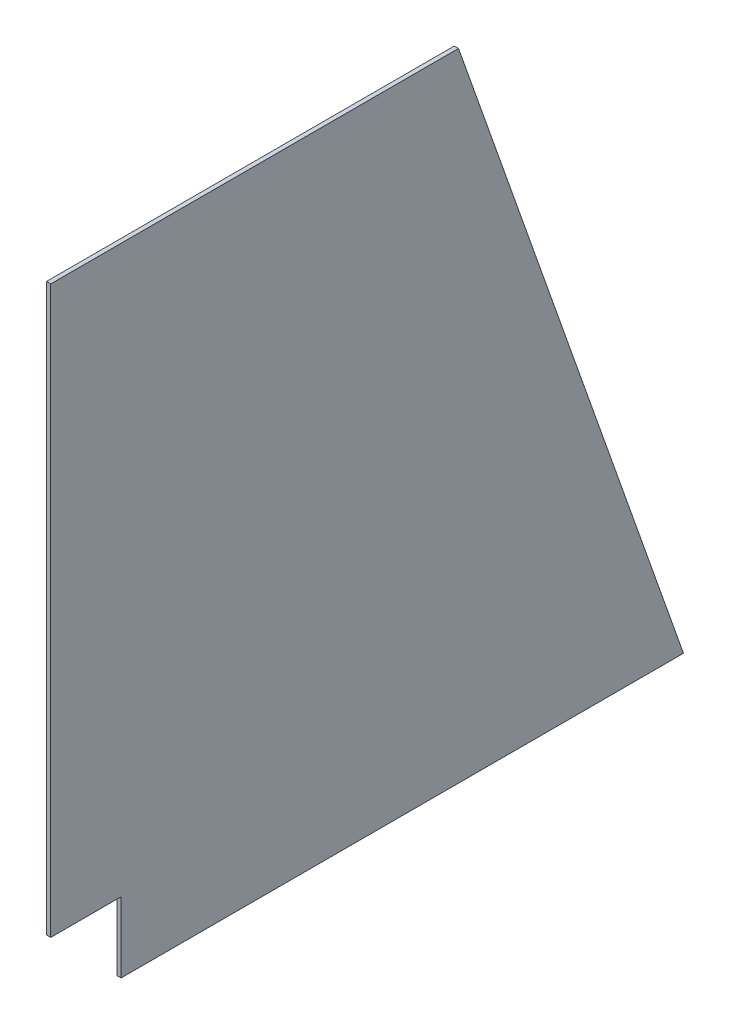
ISO-10303-21;
HEADER;
FILE_DESCRIPTION(('STEP AP214'),'2;1');
FILE_NAME('part.step','',(''),(''),'','','');
FILE_SCHEMA(('AUTOMOTIVE_DESIGN { 1 0 10303 214 1 1 1 1 }'));
ENDSEC;
DATA;
#1=APPLICATION_CONTEXT('core data for automotive mechanical design processes');
#2=APPLICATION_PROTOCOL_DEFINITION('international standard','automotive_design',2000,#1);
#3=PRODUCT_CONTEXT('',#1,'mechanical');
#4=PRODUCT('Part','Part','',(#3));
#5=PRODUCT_RELATED_PRODUCT_CATEGORY('part','',(#4));
#6=PRODUCT_DEFINITION_FORMATION('','',#4);
#7=PRODUCT_DEFINITION_CONTEXT('part definition',#1,'design');
#8=PRODUCT_DEFINITION('design','',#6,#7);
#9=PRODUCT_DEFINITION_SHAPE('','',#8);
#10=(LENGTH_UNIT() NAMED_UNIT(*) SI_UNIT(.MILLI.,.METRE.));
#11=(NAMED_UNIT(*) PLANE_ANGLE_UNIT() SI_UNIT($,.RADIAN.));
#12=(NAMED_UNIT(*) SI_UNIT($,.STERADIAN.) SOLID_ANGLE_UNIT());
#13=UNCERTAINTY_MEASURE_WITH_UNIT(LENGTH_MEASURE(1.E-05),#10,'distance_accuracy_value','');
#14=(GEOMETRIC_REPRESENTATION_CONTEXT(3) GLOBAL_UNCERTAINTY_ASSIGNED_CONTEXT((#13)) GLOBAL_UNIT_ASSIGNED_CONTEXT((#10,
#11,#12)) REPRESENTATION_CONTEXT('',''));
#15=CARTESIAN_POINT('',(0.,0.,0.));
#16=DIRECTION('',(0.,0.,1.));
#17=DIRECTION('',(1.,0.,0.));
#18=AXIS2_PLACEMENT_3D('',#15,#16,#17);
#19=CARTESIAN_POINT('',(3.,625.573683548744,258.33033120368));
#20=DIRECTION('',(0.,-1.,0.));
#21=DIRECTION('',(0.,0.,-1.));
#22=AXIS2_PLACEMENT_3D('',#19,#20,#21);
#23=PLANE('',#22);
#24=DIRECTION('',(0.,0.,1.));
#25=VECTOR('',#24,1.);
#26=CARTESIAN_POINT('',(0.,625.573683548744,258.33033120368));
#27=LINE('',#26,#25);
#28=CARTESIAN_POINT('',(0.,625.573683548744,-31.66966879632));
#29=VERTEX_POINT('',#28);
#30=CARTESIAN_POINT('',(0.,625.573683548744,258.33033120368));
#31=VERTEX_POINT('',#30);
#32=EDGE_CURVE('E132',#29,#31,#27,.T.);
#33=ORIENTED_EDGE('',*,*,#32,.T.);
#34=DIRECTION('',(-1.,0.,0.));
#35=VECTOR('',#34,1.);
#36=CARTESIAN_POINT('',(3.,625.573683548744,258.33033120368));
#37=LINE('',#36,#35);
#38=CARTESIAN_POINT('',(3.,625.573683548744,258.33033120368));
#39=VERTEX_POINT('',#38);
#40=EDGE_CURVE('E11',#39,#31,#37,.T.);
#41=ORIENTED_EDGE('',*,*,#40,.F.);
#42=DIRECTION('',(0.,0.,1.));
#43=VECTOR('',#42,1.);
#44=CARTESIAN_POINT('',(3.,625.573683548744,258.33033120368));
#45=LINE('',#44,#43);
#46=CARTESIAN_POINT('',(3.,625.573683548744,-31.66966879632));
#47=VERTEX_POINT('',#46);
#48=EDGE_CURVE('E133',#47,#39,#45,.T.);
#49=ORIENTED_EDGE('',*,*,#48,.F.);
#50=DIRECTION('',(-1.,0.,0.));
#51=VECTOR('',#50,1.);
#52=CARTESIAN_POINT('',(3.,625.573683548744,-31.66966879632));
#53=LINE('',#52,#51);
#54=EDGE_CURVE('E143',#47,#29,#53,.T.);
#55=ORIENTED_EDGE('',*,*,#54,.T.);
#56=EDGE_LOOP('',(#33,#41,#49,#55));
#57=FACE_BOUND('',#56,.T.);
#58=ADVANCED_FACE('F38',(#57),#23,.F.);
#59=CARTESIAN_POINT('',(3.,625.573683548744,258.33033120368));
#60=DIRECTION('',(0.,0.,-1.));
#61=DIRECTION('',(-1.,0.,0.));
#62=AXIS2_PLACEMENT_3D('',#59,#60,#61);
#63=PLANE('',#62);
#64=DIRECTION('',(0.,-1.,0.));
#65=VECTOR('',#64,1.);
#66=CARTESIAN_POINT('',(0.,625.573683548744,258.33033120368));
#67=LINE('',#66,#65);
#68=CARTESIAN_POINT('',(0.,223.025343589353,258.33033120368));
#69=VERTEX_POINT('',#68);
#70=EDGE_CURVE('E147',#31,#69,#67,.T.);
#71=ORIENTED_EDGE('',*,*,#70,.T.);
#72=DIRECTION('',(-1.,0.,0.));
#73=VECTOR('',#72,1.);
#74=CARTESIAN_POINT('',(10.,223.025343589353,258.33033120368));
#75=LINE('',#74,#73);
#76=CARTESIAN_POINT('',(3.,223.025343589353,258.33033120368));
#77=VERTEX_POINT('',#76);
#78=EDGE_CURVE('E53',#77,#69,#75,.T.);
#79=ORIENTED_EDGE('',*,*,#78,.F.);
#80=DIRECTION('',(0.,-1.,0.));
#81=VECTOR('',#80,1.);
#82=CARTESIAN_POINT('',(3.,625.573683548744,258.33033120368));
#83=LINE('',#82,#81);
#84=EDGE_CURVE('E84',#39,#77,#83,.T.);
#85=ORIENTED_EDGE('',*,*,#84,.F.);
#86=ORIENTED_EDGE('',*,*,#40,.T.);
#87=EDGE_LOOP('',(#71,#79,#85,#86));
#88=FACE_BOUND('',#87,.T.);
#89=ADVANCED_FACE('F165',(#88),#63,.F.);
#90=CARTESIAN_POINT('',(3.,173.025343589354,-191.66966879632));
#91=DIRECTION('',(0.,1.,0.));
#92=DIRECTION('',(0.,0.,1.));
#93=AXIS2_PLACEMENT_3D('',#90,#91,#92);
#94=PLANE('',#93);
#95=DIRECTION('',(0.,0.,-1.));
#96=VECTOR('',#95,1.);
#97=CARTESIAN_POINT('',(3.,173.025343589354,-191.66966879632));
#98=LINE('',#97,#96);
#99=CARTESIAN_POINT('',(3.,173.025343589353,208.33033120368));
#100=VERTEX_POINT('',#99);
#101=CARTESIAN_POINT('',(3.,173.025343589354,-191.66966879632));
#102=VERTEX_POINT('',#101);
#103=EDGE_CURVE('E138',#100,#102,#98,.T.);
#104=ORIENTED_EDGE('',*,*,#103,.F.);
#105=DIRECTION('',(-1.,0.,0.));
#106=VECTOR('',#105,1.);
#107=CARTESIAN_POINT('',(10.,173.025343589353,208.33033120368));
#108=LINE('',#107,#106);
#109=CARTESIAN_POINT('',(0.,173.025343589353,208.33033120368));
#110=VERTEX_POINT('',#109);
#111=EDGE_CURVE('E109',#100,#110,#108,.T.);
#112=ORIENTED_EDGE('',*,*,#111,.T.);
#113=DIRECTION('',(0.,0.,-1.));
#114=VECTOR('',#113,1.);
#115=CARTESIAN_POINT('',(0.,173.025343589354,-191.66966879632));
#116=LINE('',#115,#114);
#117=CARTESIAN_POINT('',(0.,173.025343589354,-191.66966879632));
#118=VERTEX_POINT('',#117);
#119=EDGE_CURVE('E119',#110,#118,#116,.T.);
#120=ORIENTED_EDGE('',*,*,#119,.T.);
#121=DIRECTION('',(-1.,0.,0.));
#122=VECTOR('',#121,1.);
#123=CARTESIAN_POINT('',(3.,173.025343589354,-191.66966879632));
#124=LINE('',#123,#122);
#125=EDGE_CURVE('E46',#102,#118,#124,.T.);
#126=ORIENTED_EDGE('',*,*,#125,.F.);
#127=EDGE_LOOP('',(#104,#112,#120,#126));
#128=FACE_BOUND('',#127,.T.);
#129=ADVANCED_FACE('F167',(#128),#94,.F.);
#130=CARTESIAN_POINT('',(3.,625.573683548744,-31.66966879632));
#131=DIRECTION('',(0.,-0.333333333333333,0.942809041582063));
#132=DIRECTION('',(0.,-0.942809041582063,-0.333333333333333));
#133=AXIS2_PLACEMENT_3D('',#130,#131,#132);
#134=PLANE('',#133);
#135=DIRECTION('',(0.,0.942809041582063,0.333333333333333));
#136=VECTOR('',#135,1.);
#137=CARTESIAN_POINT('',(0.,625.573683548744,-31.66966879632));
#138=LINE('',#137,#136);
#139=EDGE_CURVE('E79',#118,#29,#138,.T.);
#140=ORIENTED_EDGE('',*,*,#139,.T.);
#141=ORIENTED_EDGE('',*,*,#54,.F.);
#142=DIRECTION('',(0.,0.942809041582063,0.333333333333333));
#143=VECTOR('',#142,1.);
#144=CARTESIAN_POINT('',(3.,625.573683548744,-31.66966879632));
#145=LINE('',#144,#143);
#146=EDGE_CURVE('E62',#102,#47,#145,.T.);
#147=ORIENTED_EDGE('',*,*,#146,.F.);
#148=ORIENTED_EDGE('',*,*,#125,.T.);
#149=EDGE_LOOP('',(#140,#141,#147,#148));
#150=FACE_BOUND('',#149,.T.);
#151=ADVANCED_FACE('F157',(#150),#134,.F.);
#152=CARTESIAN_POINT('',(3.,0.,0.));
#153=DIRECTION('',(-1.,0.,0.));
#154=DIRECTION('',(0.,0.,1.));
#155=AXIS2_PLACEMENT_3D('',#152,#153,#154);
#156=PLANE('',#155);
#157=DIRECTION('',(0.,0.,-1.));
#158=VECTOR('',#157,1.);
#159=CARTESIAN_POINT('',(3.,223.025343589353,0.));
#160=LINE('',#159,#158);
#161=CARTESIAN_POINT('',(3.,223.025343589353,208.33033120368));
#162=VERTEX_POINT('',#161);
#163=EDGE_CURVE('E126',#77,#162,#160,.T.);
#164=ORIENTED_EDGE('',*,*,#163,.T.);
#165=DIRECTION('',(0.,-1.,0.));
#166=VECTOR('',#165,1.);
#167=CARTESIAN_POINT('',(3.,0.,208.33033120368));
#168=LINE('',#167,#166);
#169=EDGE_CURVE('E106',#162,#100,#168,.T.);
#170=ORIENTED_EDGE('',*,*,#169,.T.);
#171=ORIENTED_EDGE('',*,*,#103,.T.);
#172=ORIENTED_EDGE('',*,*,#146,.T.);
#173=ORIENTED_EDGE('',*,*,#48,.T.);
#174=ORIENTED_EDGE('',*,*,#84,.T.);
#175=EDGE_LOOP('',(#164,#170,#171,#172,#173,#174));
#176=FACE_BOUND('',#175,.T.);
#177=ADVANCED_FACE('F164',(#176),#156,.F.);
#178=CARTESIAN_POINT('',(0.,0.,0.));
#179=DIRECTION('',(-1.,0.,0.));
#180=DIRECTION('',(0.,0.,1.));
#181=AXIS2_PLACEMENT_3D('',#178,#179,#180);
#182=PLANE('',#181);
#183=DIRECTION('',(0.,-1.,0.));
#184=VECTOR('',#183,1.);
#185=CARTESIAN_POINT('',(0.,173.025343589353,208.33033120368));
#186=LINE('',#185,#184);
#187=CARTESIAN_POINT('',(0.,223.025343589353,208.33033120368));
#188=VERTEX_POINT('',#187);
#189=EDGE_CURVE('E103',#188,#110,#186,.T.);
#190=ORIENTED_EDGE('',*,*,#189,.F.);
#191=DIRECTION('',(0.,0.,-1.));
#192=VECTOR('',#191,1.);
#193=CARTESIAN_POINT('',(0.,223.025343589353,258.33033120368));
#194=LINE('',#193,#192);
#195=EDGE_CURVE('E111',#69,#188,#194,.T.);
#196=ORIENTED_EDGE('',*,*,#195,.F.);
#197=ORIENTED_EDGE('',*,*,#70,.F.);
#198=ORIENTED_EDGE('',*,*,#32,.F.);
#199=ORIENTED_EDGE('',*,*,#139,.F.);
#200=ORIENTED_EDGE('',*,*,#119,.F.);
#201=EDGE_LOOP('',(#190,#196,#197,#198,#199,#200));
#202=FACE_BOUND('',#201,.T.);
#203=ADVANCED_FACE('F118',(#202),#182,.T.);
#204=CARTESIAN_POINT('',(10.,173.025343589353,208.33033120368));
#205=DIRECTION('',(0.,0.,-1.));
#206=DIRECTION('',(-1.,0.,0.));
#207=AXIS2_PLACEMENT_3D('',#204,#205,#206);
#208=PLANE('',#207);
#209=DIRECTION('',(-1.,0.,0.));
#210=VECTOR('',#209,1.);
#211=CARTESIAN_POINT('',(10.,223.025343589353,208.33033120368));
#212=LINE('',#211,#210);
#213=EDGE_CURVE('E100',#162,#188,#212,.T.);
#214=ORIENTED_EDGE('',*,*,#213,.T.);
#215=ORIENTED_EDGE('',*,*,#189,.T.);
#216=ORIENTED_EDGE('',*,*,#111,.F.);
#217=ORIENTED_EDGE('',*,*,#169,.F.);
#218=EDGE_LOOP('',(#214,#215,#216,#217));
#219=FACE_BOUND('',#218,.T.);
#220=ADVANCED_FACE('F101',(#219),#208,.F.);
#221=CARTESIAN_POINT('',(10.,223.025343589353,258.33033120368));
#222=DIRECTION('',(0.,1.,0.));
#223=DIRECTION('',(0.,0.,1.));
#224=AXIS2_PLACEMENT_3D('',#221,#222,#223);
#225=PLANE('',#224);
#226=ORIENTED_EDGE('',*,*,#78,.T.);
#227=ORIENTED_EDGE('',*,*,#195,.T.);
#228=ORIENTED_EDGE('',*,*,#213,.F.);
#229=ORIENTED_EDGE('',*,*,#163,.F.);
#230=EDGE_LOOP('',(#226,#227,#228,#229));
#231=FACE_BOUND('',#230,.T.);
#232=ADVANCED_FACE('F112',(#231),#225,.F.);
#233=CLOSED_SHELL('',(#58,#89,#129,#151,#177,#203,#220,#232));
#234=MANIFOLD_SOLID_BREP('B2',#233);
#235=ADVANCED_BREP_SHAPE_REPRESENTATION('',(#18,#234),#14);
#236=SHAPE_DEFINITION_REPRESENTATION(#9,#235);
ENDSEC;
END-ISO-10303-21;
